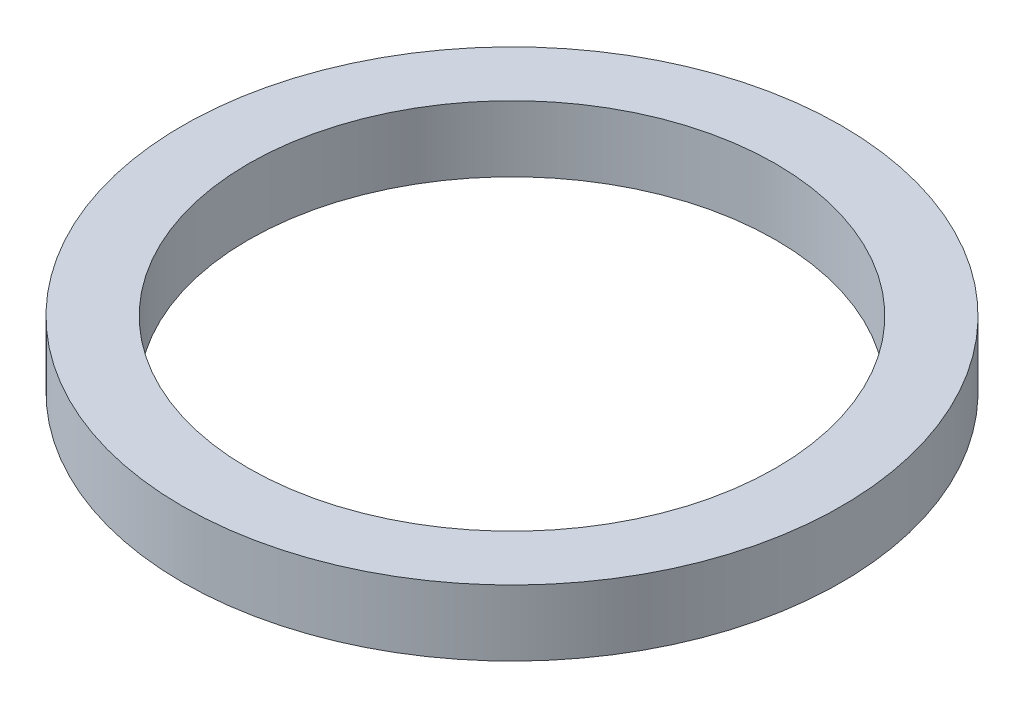
ISO-10303-21;
HEADER;
FILE_DESCRIPTION(('STEP AP214'),'2;1');
FILE_NAME('part.step','',(''),(''),'','','');
FILE_SCHEMA(('AUTOMOTIVE_DESIGN { 1 0 10303 214 1 1 1 1 }'));
ENDSEC;
DATA;
#1=APPLICATION_CONTEXT('core data for automotive mechanical design processes');
#2=APPLICATION_PROTOCOL_DEFINITION('international standard','automotive_design',2000,#1);
#3=PRODUCT_CONTEXT('',#1,'mechanical');
#4=PRODUCT('Part','Part','',(#3));
#5=PRODUCT_RELATED_PRODUCT_CATEGORY('part','',(#4));
#6=PRODUCT_DEFINITION_FORMATION('','',#4);
#7=PRODUCT_DEFINITION_CONTEXT('part definition',#1,'design');
#8=PRODUCT_DEFINITION('design','',#6,#7);
#9=PRODUCT_DEFINITION_SHAPE('','',#8);
#10=(LENGTH_UNIT() NAMED_UNIT(*) SI_UNIT(.MILLI.,.METRE.));
#11=(NAMED_UNIT(*) PLANE_ANGLE_UNIT() SI_UNIT($,.RADIAN.));
#12=(NAMED_UNIT(*) SI_UNIT($,.STERADIAN.) SOLID_ANGLE_UNIT());
#13=UNCERTAINTY_MEASURE_WITH_UNIT(LENGTH_MEASURE(1.E-05),#10,'distance_accuracy_value','');
#14=(GEOMETRIC_REPRESENTATION_CONTEXT(3) GLOBAL_UNCERTAINTY_ASSIGNED_CONTEXT((#13)) GLOBAL_UNIT_ASSIGNED_CONTEXT((#10,
#11,#12)) REPRESENTATION_CONTEXT('',''));
#15=CARTESIAN_POINT('',(0.,0.,0.));
#16=DIRECTION('',(0.,0.,1.));
#17=DIRECTION('',(1.,0.,0.));
#18=AXIS2_PLACEMENT_3D('',#15,#16,#17);
#19=CARTESIAN_POINT('',(0.,1.,0.));
#20=DIRECTION('',(0.,1.,0.));
#21=DIRECTION('',(0.,0.,1.));
#22=AXIS2_PLACEMENT_3D('',#19,#20,#21);
#23=PLANE('',#22);
#24=CARTESIAN_POINT('',(0.,1.,0.));
#25=DIRECTION('',(0.,1.,0.));
#26=DIRECTION('',(0.,0.,1.));
#27=AXIS2_PLACEMENT_3D('',#24,#25,#26);
#28=CIRCLE('',#27,5.);
#29=CARTESIAN_POINT('',(0.,1.,5.));
#30=VERTEX_POINT('',#29);
#31=EDGE_CURVE('E10',#30,#30,#28,.T.);
#32=ORIENTED_EDGE('',*,*,#31,.T.);
#33=EDGE_LOOP('',(#32));
#34=FACE_BOUND('',#33,.T.);
#35=CARTESIAN_POINT('',(0.,1.,0.));
#36=DIRECTION('',(0.,1.,0.));
#37=DIRECTION('',(0.,0.,1.));
#38=AXIS2_PLACEMENT_3D('',#35,#36,#37);
#39=CIRCLE('',#38,4.);
#40=CARTESIAN_POINT('',(0.,1.,4.));
#41=VERTEX_POINT('',#40);
#42=EDGE_CURVE('E56',#41,#41,#39,.T.);
#43=ORIENTED_EDGE('',*,*,#42,.F.);
#44=EDGE_LOOP('',(#43));
#45=FACE_BOUND('',#44,.T.);
#46=ADVANCED_FACE('F43',(#34,#45),#23,.T.);
#47=CARTESIAN_POINT('',(0.,0.,0.));
#48=DIRECTION('',(0.,1.,0.));
#49=DIRECTION('',(0.,0.,1.));
#50=AXIS2_PLACEMENT_3D('',#47,#48,#49);
#51=PLANE('',#50);
#52=CARTESIAN_POINT('',(0.,0.,0.));
#53=DIRECTION('',(0.,1.,0.));
#54=DIRECTION('',(0.,0.,1.));
#55=AXIS2_PLACEMENT_3D('',#52,#53,#54);
#56=CIRCLE('',#55,5.);
#57=CARTESIAN_POINT('',(0.,0.,5.));
#58=VERTEX_POINT('',#57);
#59=EDGE_CURVE('E47',#58,#58,#56,.T.);
#60=ORIENTED_EDGE('',*,*,#59,.F.);
#61=EDGE_LOOP('',(#60));
#62=FACE_BOUND('',#61,.T.);
#63=CARTESIAN_POINT('',(0.,0.,0.));
#64=DIRECTION('',(0.,1.,0.));
#65=DIRECTION('',(0.,0.,1.));
#66=AXIS2_PLACEMENT_3D('',#63,#64,#65);
#67=CIRCLE('',#66,4.);
#68=CARTESIAN_POINT('',(0.,0.,4.));
#69=VERTEX_POINT('',#68);
#70=EDGE_CURVE('E58',#69,#69,#67,.T.);
#71=ORIENTED_EDGE('',*,*,#70,.T.);
#72=EDGE_LOOP('',(#71));
#73=FACE_BOUND('',#72,.T.);
#74=ADVANCED_FACE('F70',(#62,#73),#51,.F.);
#75=CARTESIAN_POINT('',(0.,1.,0.));
#76=DIRECTION('',(0.,-1.,0.));
#77=DIRECTION('',(0.,0.,-1.));
#78=AXIS2_PLACEMENT_3D('',#75,#76,#77);
#79=CYLINDRICAL_SURFACE('',#78,5.);
#80=ORIENTED_EDGE('',*,*,#31,.F.);
#81=EDGE_LOOP('',(#80));
#82=FACE_BOUND('',#81,.T.);
#83=ORIENTED_EDGE('',*,*,#59,.T.);
#84=EDGE_LOOP('',(#83));
#85=FACE_BOUND('',#84,.T.);
#86=ADVANCED_FACE('F45',(#82,#85),#79,.T.);
#87=CARTESIAN_POINT('',(0.,1.,0.));
#88=DIRECTION('',(0.,-1.,0.));
#89=DIRECTION('',(0.,0.,-1.));
#90=AXIS2_PLACEMENT_3D('',#87,#88,#89);
#91=CYLINDRICAL_SURFACE('',#90,4.);
#92=ORIENTED_EDGE('',*,*,#42,.T.);
#93=EDGE_LOOP('',(#92));
#94=FACE_BOUND('',#93,.T.);
#95=ORIENTED_EDGE('',*,*,#70,.F.);
#96=EDGE_LOOP('',(#95));
#97=FACE_BOUND('',#96,.T.);
#98=ADVANCED_FACE('F66',(#94,#97),#91,.F.);
#99=CLOSED_SHELL('',(#46,#74,#86,#98));
#100=MANIFOLD_SOLID_BREP('B2',#99);
#101=ADVANCED_BREP_SHAPE_REPRESENTATION('',(#18,#100),#14);
#102=SHAPE_DEFINITION_REPRESENTATION(#9,#101);
ENDSEC;
END-ISO-10303-21;
